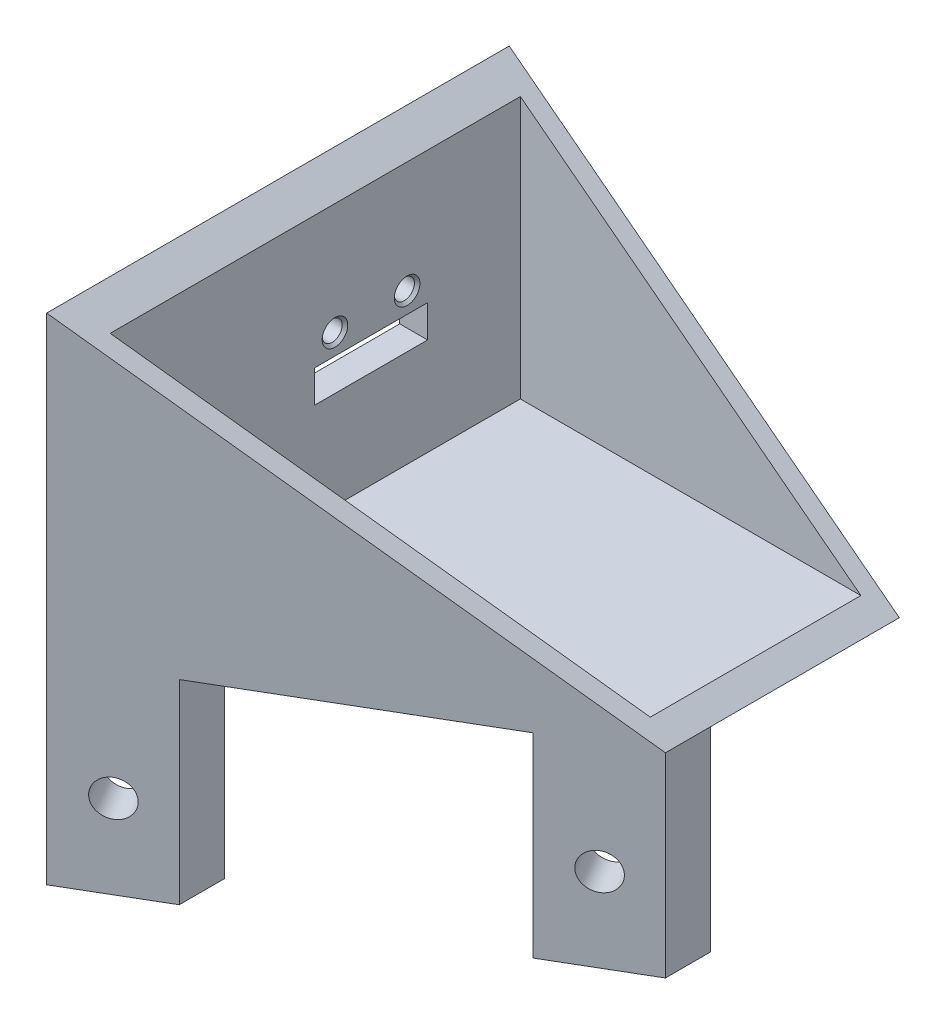
ISO-10303-21;
HEADER;
FILE_DESCRIPTION(('STEP AP214'),'2;1');
FILE_NAME('part.step','',(''),(''),'','','');
FILE_SCHEMA(('AUTOMOTIVE_DESIGN { 1 0 10303 214 1 1 1 1 }'));
ENDSEC;
DATA;
#1=APPLICATION_CONTEXT('core data for automotive mechanical design processes');
#2=APPLICATION_PROTOCOL_DEFINITION('international standard','automotive_design',2000,#1);
#3=PRODUCT_CONTEXT('',#1,'mechanical');
#4=PRODUCT('Part','Part','',(#3));
#5=PRODUCT_RELATED_PRODUCT_CATEGORY('part','',(#4));
#6=PRODUCT_DEFINITION_FORMATION('','',#4);
#7=PRODUCT_DEFINITION_CONTEXT('part definition',#1,'design');
#8=PRODUCT_DEFINITION('design','',#6,#7);
#9=PRODUCT_DEFINITION_SHAPE('','',#8);
#10=(LENGTH_UNIT() NAMED_UNIT(*) SI_UNIT(.MILLI.,.METRE.));
#11=(NAMED_UNIT(*) PLANE_ANGLE_UNIT() SI_UNIT($,.RADIAN.));
#12=(NAMED_UNIT(*) SI_UNIT($,.STERADIAN.) SOLID_ANGLE_UNIT());
#13=UNCERTAINTY_MEASURE_WITH_UNIT(LENGTH_MEASURE(1.E-05),#10,'distance_accuracy_value','');
#14=(GEOMETRIC_REPRESENTATION_CONTEXT(3) GLOBAL_UNCERTAINTY_ASSIGNED_CONTEXT((#13)) GLOBAL_UNIT_ASSIGNED_CONTEXT((#10,
#11,#12)) REPRESENTATION_CONTEXT('',''));
#15=CARTESIAN_POINT('',(0.,0.,0.));
#16=DIRECTION('',(0.,0.,1.));
#17=DIRECTION('',(1.,0.,0.));
#18=AXIS2_PLACEMENT_3D('',#15,#16,#17);
#19=CARTESIAN_POINT('',(1379.94586519212,1313.31561617139,0.));
#20=DIRECTION('',(0.,1.,0.));
#21=DIRECTION('',(0.,0.,1.));
#22=AXIS2_PLACEMENT_3D('',#19,#20,#21);
#23=PLANE('',#22);
#24=DIRECTION('',(0.,0.,1.));
#25=VECTOR('',#24,1.);
#26=CARTESIAN_POINT('',(1376.04586519212,1313.31561617139,1619.04822717547));
#27=LINE('',#26,#25);
#28=CARTESIAN_POINT('',(1376.04586519212,1313.31561617139,1539.04822717547));
#29=VERTEX_POINT('',#28);
#30=CARTESIAN_POINT('',(1376.04586519212,1313.31561617139,1576.8384338469));
#31=VERTEX_POINT('',#30);
#32=EDGE_CURVE('E266',#29,#31,#27,.T.);
#33=ORIENTED_EDGE('',*,*,#32,.F.);
#34=DIRECTION('',(-1.,0.,0.));
#35=VECTOR('',#34,1.);
#36=CARTESIAN_POINT('',(1314.94586519212,1313.31561617139,1539.04822717547));
#37=LINE('',#36,#35);
#38=CARTESIAN_POINT('',(1314.94586519212,1313.31561617139,1539.04822717547));
#39=VERTEX_POINT('',#38);
#40=EDGE_CURVE('E242',#29,#39,#37,.T.);
#41=ORIENTED_EDGE('',*,*,#40,.T.);
#42=DIRECTION('',(0.,0.,-1.));
#43=VECTOR('',#42,1.);
#44=CARTESIAN_POINT('',(1314.94586519212,1313.31561617139,0.));
#45=LINE('',#44,#43);
#46=CARTESIAN_POINT('',(1314.94586519212,1313.31561617139,1576.8384338469));
#47=VERTEX_POINT('',#46);
#48=EDGE_CURVE('E256',#47,#39,#45,.T.);
#49=ORIENTED_EDGE('',*,*,#48,.F.);
#50=DIRECTION('',(-1.,0.,0.));
#51=VECTOR('',#50,1.);
#52=CARTESIAN_POINT('',(1379.94586519212,1313.31561617139,1576.8384338469));
#53=LINE('',#52,#51);
#54=EDGE_CURVE('E261',#31,#47,#53,.T.);
#55=ORIENTED_EDGE('',*,*,#54,.F.);
#56=EDGE_LOOP('',(#33,#41,#49,#55));
#57=FACE_BOUND('',#56,.T.);
#58=ADVANCED_FACE('F47',(#57),#23,.T.);
#59=CARTESIAN_POINT('',(0.,1310.31561617139,0.));
#60=DIRECTION('',(0.,1.,0.));
#61=DIRECTION('',(0.,0.,1.));
#62=AXIS2_PLACEMENT_3D('',#59,#60,#61);
#63=PLANE('',#62);
#64=DIRECTION('',(0.862702426419676,0.,-0.505711897674559));
#65=VECTOR('',#64,1.);
#66=CARTESIAN_POINT('',(1309.94586519212,1310.31561617139,1619.04822717547));
#67=LINE('',#66,#65);
#68=CARTESIAN_POINT('',(1324.94586519212,1310.31561617139,1610.25530132663));
#69=VERTEX_POINT('',#68);
#70=CARTESIAN_POINT('',(1364.94586519212,1310.31561617139,1586.80749906307));
#71=VERTEX_POINT('',#70);
#72=EDGE_CURVE('E278',#69,#71,#67,.T.);
#73=ORIENTED_EDGE('',*,*,#72,.F.);
#74=DIRECTION('',(0.,0.,-1.));
#75=VECTOR('',#74,1.);
#76=CARTESIAN_POINT('',(1324.94586519212,1310.31561617139,0.));
#77=LINE('',#76,#75);
#78=CARTESIAN_POINT('',(1324.94586519212,1310.31561617139,1602.14126364037));
#79=VERTEX_POINT('',#78);
#80=EDGE_CURVE('E304',#69,#79,#77,.T.);
#81=ORIENTED_EDGE('',*,*,#80,.T.);
#82=DIRECTION('',(0.862702426419676,0.,-0.505711897674558));
#83=VECTOR('',#82,1.);
#84=CARTESIAN_POINT('',(1037.82804690447,1310.31561617139,1770.44830937922));
#85=LINE('',#84,#83);
#86=CARTESIAN_POINT('',(1309.94586519212,1310.31561617139,1610.93418948921));
#87=VERTEX_POINT('',#86);
#88=EDGE_CURVE('E293',#87,#79,#85,.T.);
#89=ORIENTED_EDGE('',*,*,#88,.F.);
#90=DIRECTION('',(0.,0.,1.));
#91=VECTOR('',#90,1.);
#92=CARTESIAN_POINT('',(1309.94586519212,1310.31561617139,0.));
#93=LINE('',#92,#91);
#94=CARTESIAN_POINT('',(1309.94586519212,1310.31561617139,1536.04822717547));
#95=VERTEX_POINT('',#94);
#96=EDGE_CURVE('E356',#95,#87,#93,.T.);
#97=ORIENTED_EDGE('',*,*,#96,.F.);
#98=DIRECTION('',(-1.,0.,0.));
#99=VECTOR('',#98,1.);
#100=CARTESIAN_POINT('',(1379.94586519212,1310.31561617139,1536.04822717547));
#101=LINE('',#100,#99);
#102=CARTESIAN_POINT('',(1379.94586519212,1310.31561617139,1536.04822717547));
#103=VERTEX_POINT('',#102);
#104=EDGE_CURVE('E246',#103,#95,#101,.T.);
#105=ORIENTED_EDGE('',*,*,#104,.F.);
#106=DIRECTION('',(0.,0.,1.));
#107=VECTOR('',#106,1.);
#108=CARTESIAN_POINT('',(1379.94586519212,1310.31561617139,0.));
#109=LINE('',#108,#107);
#110=CARTESIAN_POINT('',(1379.94586519212,1310.31561617139,1569.90053552798));
#111=VERTEX_POINT('',#110);
#112=EDGE_CURVE('E185',#103,#111,#109,.T.);
#113=ORIENTED_EDGE('',*,*,#112,.T.);
#114=DIRECTION('',(0.862702426419676,0.,-0.505711897674558));
#115=VECTOR('',#114,1.);
#116=CARTESIAN_POINT('',(1037.82804690447,1310.31561617139,1770.44830937922));
#117=LINE('',#116,#115);
#118=CARTESIAN_POINT('',(1364.94586519212,1310.31561617139,1578.69346137681));
#119=VERTEX_POINT('',#118);
#120=EDGE_CURVE('E338',#119,#111,#117,.T.);
#121=ORIENTED_EDGE('',*,*,#120,.F.);
#122=DIRECTION('',(0.,0.,-1.));
#123=VECTOR('',#122,1.);
#124=CARTESIAN_POINT('',(1364.94586519212,1310.31561617139,0.));
#125=LINE('',#124,#123);
#126=EDGE_CURVE('E290',#71,#119,#125,.T.);
#127=ORIENTED_EDGE('',*,*,#126,.F.);
#128=EDGE_LOOP('',(#73,#81,#89,#97,#105,#113,#121,#127));
#129=FACE_BOUND('',#128,.T.);
#130=ADVANCED_FACE('F428',(#129),#63,.F.);
#131=CARTESIAN_POINT('',(1146.22905807246,1490.09777549421,1619.04822717547));
#132=DIRECTION('',(0.609710760849692,0.792623989104601,0.));
#133=DIRECTION('',(-0.792623989104601,0.609710760849692,0.));
#134=AXIS2_PLACEMENT_3D('',#131,#132,#133);
#135=PLANE('',#134);
#136=DIRECTION('',(0.718821889872621,-0.552939915286631,-0.421369838411302));
#137=VECTOR('',#136,1.);
#138=CARTESIAN_POINT('',(1174.24869753423,1468.54420667746,1695.13093596162));
#139=LINE('',#138,#137);
#140=CARTESIAN_POINT('',(1314.94586519212,1360.31561617139,1612.65495180449));
#141=VERTEX_POINT('',#140);
#142=EDGE_CURVE('E194',#141,#31,#139,.T.);
#143=ORIENTED_EDGE('',*,*,#142,.F.);
#144=DIRECTION('',(0.,0.,-1.));
#145=VECTOR('',#144,1.);
#146=CARTESIAN_POINT('',(1314.94586519212,1360.31561617139,0.));
#147=LINE('',#146,#145);
#148=CARTESIAN_POINT('',(1314.94586519212,1360.31561617139,1539.04822717547));
#149=VERTEX_POINT('',#148);
#150=EDGE_CURVE('E257',#141,#149,#147,.T.);
#151=ORIENTED_EDGE('',*,*,#150,.T.);
#152=DIRECTION('',(0.792623989104601,-0.609710760849691,0.));
#153=VECTOR('',#152,1.);
#154=CARTESIAN_POINT('',(1376.04586519212,1313.31561617139,1539.04822717547));
#155=LINE('',#154,#153);
#156=EDGE_CURVE('E233',#149,#29,#155,.T.);
#157=ORIENTED_EDGE('',*,*,#156,.T.);
#158=ORIENTED_EDGE('',*,*,#32,.T.);
#159=EDGE_LOOP('',(#143,#151,#157,#158));
#160=FACE_BOUND('',#159,.T.);
#161=DIRECTION('',(0.,0.,-1.));
#162=VECTOR('',#161,1.);
#163=CARTESIAN_POINT('',(1309.94586519212,1364.16177001755,1624.39286725715));
#164=LINE('',#163,#162);
#165=CARTESIAN_POINT('',(1309.94586519212,1364.16177001755,1619.04822717547));
#166=VERTEX_POINT('',#165);
#167=CARTESIAN_POINT('',(1309.94586519212,1364.16177001755,1536.04822717547));
#168=VERTEX_POINT('',#167);
#169=EDGE_CURVE('E177',#166,#168,#164,.T.);
#170=ORIENTED_EDGE('',*,*,#169,.F.);
#171=DIRECTION('',(0.718821889872622,-0.552939915286631,-0.421369838411301));
#172=VECTOR('',#171,1.);
#173=CARTESIAN_POINT('',(1175.29739313558,1467.73751775335,1697.97849587228));
#174=LINE('',#173,#172);
#175=CARTESIAN_POINT('',(1379.94586519212,1310.31561617139,1578.01457321424));
#176=VERTEX_POINT('',#175);
#177=EDGE_CURVE('E181',#166,#176,#174,.T.);
#178=ORIENTED_EDGE('',*,*,#177,.T.);
#179=DIRECTION('',(0.,0.,1.));
#180=VECTOR('',#179,1.);
#181=CARTESIAN_POINT('',(1379.94586519212,1310.31561617139,0.));
#182=LINE('',#181,#180);
#183=EDGE_CURVE('E324',#111,#176,#182,.T.);
#184=ORIENTED_EDGE('',*,*,#183,.F.);
#185=ORIENTED_EDGE('',*,*,#112,.F.);
#186=DIRECTION('',(0.792623989104612,-0.609710760849677,0.));
#187=VECTOR('',#186,1.);
#188=CARTESIAN_POINT('',(1376.04586519212,1313.31561617139,1536.04822717547));
#189=LINE('',#188,#187);
#190=EDGE_CURVE('E199',#168,#103,#189,.T.);
#191=ORIENTED_EDGE('',*,*,#190,.F.);
#192=EDGE_LOOP('',(#170,#178,#184,#185,#191));
#193=FACE_BOUND('',#192,.T.);
#194=ADVANCED_FACE('F198',(#160,#193),#135,.T.);
#195=CARTESIAN_POINT('',(1309.94586519212,1360.31561617139,0.));
#196=DIRECTION('',(1.,0.,0.));
#197=DIRECTION('',(0.,0.,-1.));
#198=AXIS2_PLACEMENT_3D('',#195,#196,#197);
#199=PLANE('',#198);
#200=DIRECTION('',(0.,0.,-1.));
#201=VECTOR('',#200,1.);
#202=CARTESIAN_POINT('',(1309.94586519212,1336.60561617139,0.));
#203=LINE('',#202,#201);
#204=CARTESIAN_POINT('',(1309.94586519212,1336.60561617139,1575.99434883277));
#205=VERTEX_POINT('',#204);
#206=CARTESIAN_POINT('',(1309.94586519212,1336.60561617139,1555.69434883277));
#207=VERTEX_POINT('',#206);
#208=EDGE_CURVE('E218',#205,#207,#203,.T.);
#209=ORIENTED_EDGE('',*,*,#208,.F.);
#210=DIRECTION('',(0.,-1.,0.));
#211=VECTOR('',#210,1.);
#212=CARTESIAN_POINT('',(1309.94586519212,-5.078970138616E-11,1575.99434883273));
#213=LINE('',#212,#211);
#214=CARTESIAN_POINT('',(1309.94586519212,1330.80561617139,1575.99434883277));
#215=VERTEX_POINT('',#214);
#216=EDGE_CURVE('E210',#205,#215,#213,.T.);
#217=ORIENTED_EDGE('',*,*,#216,.T.);
#218=DIRECTION('',(0.,0.,-1.));
#219=VECTOR('',#218,1.);
#220=CARTESIAN_POINT('',(1309.94586519212,1330.80561617139,0.));
#221=LINE('',#220,#219);
#222=CARTESIAN_POINT('',(1309.94586519212,1330.80561617139,1555.69434883277));
#223=VERTEX_POINT('',#222);
#224=EDGE_CURVE('E214',#215,#223,#221,.T.);
#225=ORIENTED_EDGE('',*,*,#224,.T.);
#226=DIRECTION('',(0.,-1.,0.));
#227=VECTOR('',#226,1.);
#228=CARTESIAN_POINT('',(1309.94586519212,0.,1555.69434883277));
#229=LINE('',#228,#227);
#230=EDGE_CURVE('E216',#207,#223,#229,.T.);
#231=ORIENTED_EDGE('',*,*,#230,.F.);
#232=EDGE_LOOP('',(#209,#217,#225,#231));
#233=FACE_BOUND('',#232,.T.);
#234=CARTESIAN_POINT('',(1309.94586519212,1340.29561617139,1559.36934883277));
#235=DIRECTION('',(1.,0.,0.));
#236=DIRECTION('',(0.,0.,-1.));
#237=AXIS2_PLACEMENT_3D('',#234,#235,#236);
#238=CIRCLE('',#237,1.79999999999998);
#239=CARTESIAN_POINT('',(1309.94586519212,1340.29561617139,1557.56934883277));
#240=VERTEX_POINT('',#239);
#241=EDGE_CURVE('E354',#240,#240,#238,.T.);
#242=ORIENTED_EDGE('',*,*,#241,.T.);
#243=EDGE_LOOP('',(#242));
#244=FACE_BOUND('',#243,.T.);
#245=CARTESIAN_POINT('',(1309.94586519212,1340.29561617139,1572.31934883277));
#246=DIRECTION('',(1.,0.,0.));
#247=DIRECTION('',(0.,0.,-1.));
#248=AXIS2_PLACEMENT_3D('',#245,#246,#247);
#249=CIRCLE('',#248,1.79999999999998);
#250=CARTESIAN_POINT('',(1309.94586519212,1340.29561617139,1570.51934883277));
#251=VERTEX_POINT('',#250);
#252=EDGE_CURVE('E318',#251,#251,#249,.T.);
#253=ORIENTED_EDGE('',*,*,#252,.T.);
#254=EDGE_LOOP('',(#253));
#255=FACE_BOUND('',#254,.T.);
#256=ORIENTED_EDGE('',*,*,#96,.T.);
#257=DIRECTION('',(0.,1.,0.));
#258=VECTOR('',#257,1.);
#259=CARTESIAN_POINT('',(1309.94586519212,1275.31561617139,1610.93418948921));
#260=LINE('',#259,#258);
#261=CARTESIAN_POINT('',(1309.94586519212,1275.31561617139,1610.93418948921));
#262=VERTEX_POINT('',#261);
#263=EDGE_CURVE('E315',#262,#87,#260,.T.);
#264=ORIENTED_EDGE('',*,*,#263,.F.);
#265=DIRECTION('',(0.,0.,-1.));
#266=VECTOR('',#265,1.);
#267=CARTESIAN_POINT('',(1309.94586519212,1275.31561617139,0.));
#268=LINE('',#267,#266);
#269=CARTESIAN_POINT('',(1309.94586519212,1275.31561617139,1619.04822717547));
#270=VERTEX_POINT('',#269);
#271=EDGE_CURVE('E179',#270,#262,#268,.T.);
#272=ORIENTED_EDGE('',*,*,#271,.F.);
#273=DIRECTION('',(0.,-1.,0.));
#274=VECTOR('',#273,1.);
#275=CARTESIAN_POINT('',(1309.94586519212,1360.31561617139,1619.04822717547));
#276=LINE('',#275,#274);
#277=EDGE_CURVE('E169',#166,#270,#276,.T.);
#278=ORIENTED_EDGE('',*,*,#277,.F.);
#279=ORIENTED_EDGE('',*,*,#169,.T.);
#280=DIRECTION('',(0.,1.,0.));
#281=VECTOR('',#280,1.);
#282=CARTESIAN_POINT('',(1309.94586519212,1360.31561617139,1536.04822717547));
#283=LINE('',#282,#281);
#284=EDGE_CURVE('E251',#95,#168,#283,.T.);
#285=ORIENTED_EDGE('',*,*,#284,.F.);
#286=EDGE_LOOP('',(#256,#264,#272,#278,#279,#285));
#287=FACE_BOUND('',#286,.T.);
#288=ADVANCED_FACE('F173',(#233,#244,#255,#287),#199,.F.);
#289=CARTESIAN_POINT('',(1309.94586519212,1340.29561617139,1572.31934883277));
#290=DIRECTION('',(1.,0.,0.));
#291=DIRECTION('',(0.,0.,-1.));
#292=AXIS2_PLACEMENT_3D('',#289,#290,#291);
#293=CYLINDRICAL_SURFACE('',#292,1.79999999999998);
#294=CARTESIAN_POINT('',(1314.44586519212,1340.29561617139,1572.31934883277));
#295=DIRECTION('',(-1.,0.,0.));
#296=DIRECTION('',(0.,0.,1.));
#297=AXIS2_PLACEMENT_3D('',#294,#295,#296);
#298=CIRCLE('',#297,1.79999999999998);
#299=CARTESIAN_POINT('',(1314.44586519212,1340.29561617139,1574.11934883277));
#300=VERTEX_POINT('',#299);
#301=EDGE_CURVE('E11',#300,#300,#298,.F.);
#302=ORIENTED_EDGE('',*,*,#301,.T.);
#303=EDGE_LOOP('',(#302));
#304=FACE_BOUND('',#303,.T.);
#305=ORIENTED_EDGE('',*,*,#252,.F.);
#306=EDGE_LOOP('',(#305));
#307=FACE_BOUND('',#306,.T.);
#308=ADVANCED_FACE('F473',(#304,#307),#293,.F.);
#309=CARTESIAN_POINT('',(1309.94586519212,1340.29561617139,1559.36934883277));
#310=DIRECTION('',(1.,0.,0.));
#311=DIRECTION('',(0.,0.,-1.));
#312=AXIS2_PLACEMENT_3D('',#309,#310,#311);
#313=CYLINDRICAL_SURFACE('',#312,1.79999999999998);
#314=CARTESIAN_POINT('',(1314.44586519212,1340.29561617139,1559.36934883277));
#315=DIRECTION('',(-1.,0.,0.));
#316=DIRECTION('',(0.,0.,1.));
#317=AXIS2_PLACEMENT_3D('',#314,#315,#316);
#318=CIRCLE('',#317,1.79999999999998);
#319=CARTESIAN_POINT('',(1314.44586519212,1340.29561617139,1561.16934883277));
#320=VERTEX_POINT('',#319);
#321=EDGE_CURVE('E58',#320,#320,#318,.F.);
#322=ORIENTED_EDGE('',*,*,#321,.T.);
#323=EDGE_LOOP('',(#322));
#324=FACE_BOUND('',#323,.T.);
#325=ORIENTED_EDGE('',*,*,#241,.F.);
#326=EDGE_LOOP('',(#325));
#327=FACE_BOUND('',#326,.T.);
#328=ADVANCED_FACE('F468',(#324,#327),#313,.F.);
#329=CARTESIAN_POINT('',(1364.94586519212,1275.31561617139,0.));
#330=DIRECTION('',(1.,0.,0.));
#331=DIRECTION('',(0.,0.,-1.));
#332=AXIS2_PLACEMENT_3D('',#329,#330,#331);
#333=PLANE('',#332);
#334=ORIENTED_EDGE('',*,*,#126,.T.);
#335=DIRECTION('',(0.,1.,0.));
#336=VECTOR('',#335,1.);
#337=CARTESIAN_POINT('',(1364.94586519212,1275.31561617139,1578.69346137681));
#338=LINE('',#337,#336);
#339=CARTESIAN_POINT('',(1364.94586519212,1275.31561617139,1578.69346137681));
#340=VERTEX_POINT('',#339);
#341=EDGE_CURVE('E348',#340,#119,#338,.T.);
#342=ORIENTED_EDGE('',*,*,#341,.F.);
#343=DIRECTION('',(0.,0.,-1.));
#344=VECTOR('',#343,1.);
#345=CARTESIAN_POINT('',(1364.94586519212,1275.31561617139,0.));
#346=LINE('',#345,#344);
#347=CARTESIAN_POINT('',(1364.94586519212,1275.31561617139,1586.80749906307));
#348=VERTEX_POINT('',#347);
#349=EDGE_CURVE('E323',#348,#340,#346,.T.);
#350=ORIENTED_EDGE('',*,*,#349,.F.);
#351=DIRECTION('',(0.,1.,0.));
#352=VECTOR('',#351,1.);
#353=CARTESIAN_POINT('',(1364.94586519212,1275.31561617139,1586.80749906307));
#354=LINE('',#353,#352);
#355=EDGE_CURVE('E310',#348,#71,#354,.T.);
#356=ORIENTED_EDGE('',*,*,#355,.T.);
#357=EDGE_LOOP('',(#334,#342,#350,#356));
#358=FACE_BOUND('',#357,.T.);
#359=ADVANCED_FACE('F462',(#358),#333,.F.);
#360=CARTESIAN_POINT('',(1037.82804690447,1275.31561617139,1770.44830937922));
#361=DIRECTION('',(0.505711897674558,0.,0.862702426419676));
#362=DIRECTION('',(0.862702426419676,0.,-0.505711897674558));
#363=AXIS2_PLACEMENT_3D('',#360,#361,#362);
#364=PLANE('',#363);
#365=CARTESIAN_POINT('',(1368.95452813957,1290.31561617139,1576.34360297348));
#366=DIRECTION('',(0.505711897674558,0.,0.862702426419676));
#367=DIRECTION('',(0.862702426419676,0.,-0.505711897674558));
#368=AXIS2_PLACEMENT_3D('',#365,#366,#367);
#369=CIRCLE('',#368,3.25399999999979);
#370=CARTESIAN_POINT('',(1371.76176183514,1290.31561617139,1574.69801645845));
#371=VERTEX_POINT('',#370);
#372=EDGE_CURVE('E272',#371,#371,#369,.F.);
#373=ORIENTED_EDGE('',*,*,#372,.F.);
#374=EDGE_LOOP('',(#373));
#375=FACE_BOUND('',#374,.T.);
#376=ORIENTED_EDGE('',*,*,#120,.T.);
#377=DIRECTION('',(0.,1.,0.));
#378=VECTOR('',#377,1.);
#379=CARTESIAN_POINT('',(1379.94586519212,1275.31561617139,1569.90053552798));
#380=LINE('',#379,#378);
#381=CARTESIAN_POINT('',(1379.94586519212,1275.31561617139,1569.90053552798));
#382=VERTEX_POINT('',#381);
#383=EDGE_CURVE('E342',#382,#111,#380,.T.);
#384=ORIENTED_EDGE('',*,*,#383,.F.);
#385=DIRECTION('',(0.862702426419676,0.,-0.505711897674558));
#386=VECTOR('',#385,1.);
#387=CARTESIAN_POINT('',(1037.82804690447,1275.31561617139,1770.44830937922));
#388=LINE('',#387,#386);
#389=EDGE_CURVE('E330',#340,#382,#388,.T.);
#390=ORIENTED_EDGE('',*,*,#389,.F.);
#391=ORIENTED_EDGE('',*,*,#341,.T.);
#392=EDGE_LOOP('',(#376,#384,#390,#391));
#393=FACE_BOUND('',#392,.T.);
#394=ADVANCED_FACE('F464',(#375,#393),#364,.F.);
#395=CARTESIAN_POINT('',(1379.94586519212,1275.31561617139,0.));
#396=DIRECTION('',(-1.,0.,0.));
#397=DIRECTION('',(0.,0.,1.));
#398=AXIS2_PLACEMENT_3D('',#395,#396,#397);
#399=PLANE('',#398);
#400=ORIENTED_EDGE('',*,*,#183,.T.);
#401=DIRECTION('',(0.,1.,0.));
#402=VECTOR('',#401,1.);
#403=CARTESIAN_POINT('',(1379.94586519212,1275.31561617139,1578.01457321424));
#404=LINE('',#403,#402);
#405=CARTESIAN_POINT('',(1379.94586519212,1275.31561617139,1578.01457321424));
#406=VERTEX_POINT('',#405);
#407=EDGE_CURVE('E191',#406,#176,#404,.T.);
#408=ORIENTED_EDGE('',*,*,#407,.F.);
#409=DIRECTION('',(0.,0.,1.));
#410=VECTOR('',#409,1.);
#411=CARTESIAN_POINT('',(1379.94586519212,1275.31561617139,0.));
#412=LINE('',#411,#410);
#413=EDGE_CURVE('E328',#382,#406,#412,.T.);
#414=ORIENTED_EDGE('',*,*,#413,.F.);
#415=ORIENTED_EDGE('',*,*,#383,.T.);
#416=EDGE_LOOP('',(#400,#408,#414,#415));
#417=FACE_BOUND('',#416,.T.);
#418=ADVANCED_FACE('F460',(#417),#399,.F.);
#419=CARTESIAN_POINT('',(0.,1275.31561617139,0.));
#420=DIRECTION('',(0.,-1.,0.));
#421=DIRECTION('',(0.,0.,-1.));
#422=AXIS2_PLACEMENT_3D('',#419,#420,#421);
#423=PLANE('',#422);
#424=DIRECTION('',(0.862702426419676,0.,-0.505711897674559));
#425=VECTOR('',#424,1.);
#426=CARTESIAN_POINT('',(1041.36803018819,1275.31561617139,1776.48722636415));
#427=LINE('',#426,#425);
#428=EDGE_CURVE('E319',#348,#406,#427,.T.);
#429=ORIENTED_EDGE('',*,*,#428,.F.);
#430=ORIENTED_EDGE('',*,*,#349,.T.);
#431=ORIENTED_EDGE('',*,*,#389,.T.);
#432=ORIENTED_EDGE('',*,*,#413,.T.);
#433=EDGE_LOOP('',(#429,#430,#431,#432));
#434=FACE_BOUND('',#433,.T.);
#435=ADVANCED_FACE('F454',(#434),#423,.T.);
#436=CARTESIAN_POINT('',(1324.94586519212,1275.31561617139,0.));
#437=DIRECTION('',(1.,0.,0.));
#438=DIRECTION('',(0.,0.,-1.));
#439=AXIS2_PLACEMENT_3D('',#436,#437,#438);
#440=PLANE('',#439);
#441=ORIENTED_EDGE('',*,*,#80,.F.);
#442=DIRECTION('',(0.,1.,0.));
#443=VECTOR('',#442,1.);
#444=CARTESIAN_POINT('',(1324.94586519212,1275.31561617139,1610.25530132663));
#445=LINE('',#444,#443);
#446=CARTESIAN_POINT('',(1324.94586519212,1275.31561617139,1610.25530132663));
#447=VERTEX_POINT('',#446);
#448=EDGE_CURVE('E316',#447,#69,#445,.T.);
#449=ORIENTED_EDGE('',*,*,#448,.F.);
#450=DIRECTION('',(0.,0.,-1.));
#451=VECTOR('',#450,1.);
#452=CARTESIAN_POINT('',(1324.94586519212,1275.31561617139,0.));
#453=LINE('',#452,#451);
#454=CARTESIAN_POINT('',(1324.94586519212,1275.31561617139,1602.14126364037));
#455=VERTEX_POINT('',#454);
#456=EDGE_CURVE('E288',#447,#455,#453,.T.);
#457=ORIENTED_EDGE('',*,*,#456,.T.);
#458=DIRECTION('',(0.,1.,0.));
#459=VECTOR('',#458,1.);
#460=CARTESIAN_POINT('',(1324.94586519212,1275.31561617139,1602.14126364037));
#461=LINE('',#460,#459);
#462=EDGE_CURVE('E305',#455,#79,#461,.T.);
#463=ORIENTED_EDGE('',*,*,#462,.T.);
#464=EDGE_LOOP('',(#441,#449,#457,#463));
#465=FACE_BOUND('',#464,.T.);
#466=ADVANCED_FACE('F449',(#465),#440,.T.);
#467=CARTESIAN_POINT('',(1041.36803018819,1275.31561617139,1776.48722636415));
#468=DIRECTION('',(0.505711897674559,0.,0.862702426419676));
#469=DIRECTION('',(0.862702426419676,0.,-0.505711897674559));
#470=AXIS2_PLACEMENT_3D('',#467,#468,#469);
#471=PLANE('',#470);
#472=CARTESIAN_POINT('',(1372.49451142329,1290.31561617139,1582.38251995842));
#473=DIRECTION('',(0.50571189767456,0.,0.862702426419675));
#474=DIRECTION('',(0.862702426419675,0.,-0.50571189767456));
#475=AXIS2_PLACEMENT_3D('',#472,#473,#474);
#476=CIRCLE('',#475,3.25399999999979);
#477=CARTESIAN_POINT('',(1375.30174511886,1290.31561617139,1580.73693344339));
#478=VERTEX_POINT('',#477);
#479=EDGE_CURVE('E269',#478,#478,#476,.T.);
#480=ORIENTED_EDGE('',*,*,#479,.F.);
#481=EDGE_LOOP('',(#480));
#482=FACE_BOUND('',#481,.T.);
#483=CARTESIAN_POINT('',(1317.49451142329,1290.31561617139,1614.62324807082));
#484=DIRECTION('',(0.505711897674561,0.,0.862702426419675));
#485=DIRECTION('',(0.862702426419675,0.,-0.505711897674561));
#486=AXIS2_PLACEMENT_3D('',#483,#484,#485);
#487=CIRCLE('',#486,3.2539999999995);
#488=CARTESIAN_POINT('',(1320.30174511886,1290.31561617139,1612.97766155578));
#489=VERTEX_POINT('',#488);
#490=EDGE_CURVE('E274',#489,#489,#487,.T.);
#491=ORIENTED_EDGE('',*,*,#490,.F.);
#492=EDGE_LOOP('',(#491));
#493=FACE_BOUND('',#492,.T.);
#494=ORIENTED_EDGE('',*,*,#448,.T.);
#495=ORIENTED_EDGE('',*,*,#72,.T.);
#496=ORIENTED_EDGE('',*,*,#355,.F.);
#497=ORIENTED_EDGE('',*,*,#428,.T.);
#498=ORIENTED_EDGE('',*,*,#407,.T.);
#499=ORIENTED_EDGE('',*,*,#177,.F.);
#500=ORIENTED_EDGE('',*,*,#277,.T.);
#501=DIRECTION('',(0.862702426419676,0.,-0.505711897674559));
#502=VECTOR('',#501,1.);
#503=CARTESIAN_POINT('',(1041.36803018819,1275.31561617139,1776.48722636415));
#504=LINE('',#503,#502);
#505=EDGE_CURVE('E292',#270,#447,#504,.T.);
#506=ORIENTED_EDGE('',*,*,#505,.T.);
#507=EDGE_LOOP('',(#494,#495,#496,#497,#498,#499,#500,#506));
#508=FACE_BOUND('',#507,.T.);
#509=ADVANCED_FACE('F186',(#482,#493,#508),#471,.T.);
#510=CARTESIAN_POINT('',(1037.82804690447,1275.31561617139,1770.44830937922));
#511=DIRECTION('',(0.505711897674558,0.,0.862702426419676));
#512=DIRECTION('',(0.862702426419676,0.,-0.505711897674558));
#513=AXIS2_PLACEMENT_3D('',#510,#511,#512);
#514=PLANE('',#513);
#515=CARTESIAN_POINT('',(1313.95452813957,1290.31561617139,1608.58433108588));
#516=DIRECTION('',(0.505711897674558,0.,0.862702426419676));
#517=DIRECTION('',(0.862702426419676,0.,-0.505711897674558));
#518=AXIS2_PLACEMENT_3D('',#515,#516,#517);
#519=CIRCLE('',#518,3.2539999999995);
#520=CARTESIAN_POINT('',(1316.76176183514,1290.31561617139,1606.93874457085));
#521=VERTEX_POINT('',#520);
#522=EDGE_CURVE('E267',#521,#521,#519,.F.);
#523=ORIENTED_EDGE('',*,*,#522,.F.);
#524=EDGE_LOOP('',(#523));
#525=FACE_BOUND('',#524,.T.);
#526=ORIENTED_EDGE('',*,*,#88,.T.);
#527=ORIENTED_EDGE('',*,*,#462,.F.);
#528=DIRECTION('',(0.862702426419676,0.,-0.505711897674558));
#529=VECTOR('',#528,1.);
#530=CARTESIAN_POINT('',(1037.82804690447,1275.31561617139,1770.44830937922));
#531=LINE('',#530,#529);
#532=EDGE_CURVE('E299',#262,#455,#531,.T.);
#533=ORIENTED_EDGE('',*,*,#532,.F.);
#534=ORIENTED_EDGE('',*,*,#263,.T.);
#535=EDGE_LOOP('',(#526,#527,#533,#534));
#536=FACE_BOUND('',#535,.T.);
#537=ADVANCED_FACE('F442',(#525,#536),#514,.F.);
#538=CARTESIAN_POINT('',(0.,1275.31561617139,0.));
#539=DIRECTION('',(0.,-1.,0.));
#540=DIRECTION('',(0.,0.,-1.));
#541=AXIS2_PLACEMENT_3D('',#538,#539,#540);
#542=PLANE('',#541);
#543=ORIENTED_EDGE('',*,*,#456,.F.);
#544=ORIENTED_EDGE('',*,*,#505,.F.);
#545=ORIENTED_EDGE('',*,*,#271,.T.);
#546=ORIENTED_EDGE('',*,*,#532,.T.);
#547=EDGE_LOOP('',(#543,#544,#545,#546));
#548=FACE_BOUND('',#547,.T.);
#549=ADVANCED_FACE('F438',(#548),#542,.T.);
#550=CARTESIAN_POINT('',(1309.30010660433,1290.31561617139,1600.64427515583));
#551=DIRECTION('',(0.505711897674561,0.,0.862702426419675));
#552=DIRECTION('',(0.862702426419675,0.,-0.505711897674561));
#553=AXIS2_PLACEMENT_3D('',#550,#551,#552);
#554=CYLINDRICAL_SURFACE('',#553,3.2539999999995);
#555=ORIENTED_EDGE('',*,*,#522,.T.);
#556=EDGE_LOOP('',(#555));
#557=FACE_BOUND('',#556,.T.);
#558=ORIENTED_EDGE('',*,*,#490,.T.);
#559=EDGE_LOOP('',(#558));
#560=FACE_BOUND('',#559,.T.);
#561=ADVANCED_FACE('F422',(#557,#560),#554,.F.);
#562=CARTESIAN_POINT('',(1364.30010660434,1290.31561617139,1568.40354704343));
#563=DIRECTION('',(0.505711897674561,0.,0.862702426419675));
#564=DIRECTION('',(0.862702426419675,0.,-0.505711897674561));
#565=AXIS2_PLACEMENT_3D('',#562,#563,#564);
#566=CYLINDRICAL_SURFACE('',#565,3.25399999999979);
#567=ORIENTED_EDGE('',*,*,#372,.T.);
#568=EDGE_LOOP('',(#567));
#569=FACE_BOUND('',#568,.T.);
#570=ORIENTED_EDGE('',*,*,#479,.T.);
#571=EDGE_LOOP('',(#570));
#572=FACE_BOUND('',#571,.T.);
#573=ADVANCED_FACE('F414',(#569,#572),#566,.F.);
#574=CARTESIAN_POINT('',(1379.94586519212,-277.694804413745,364.403257259703));
#575=DIRECTION('',(0.,-0.606118100972325,0.795374658682122));
#576=DIRECTION('',(0.,-0.795374658682122,-0.606118100972325));
#577=AXIS2_PLACEMENT_3D('',#574,#575,#576);
#578=PLANE('',#577);
#579=ORIENTED_EDGE('',*,*,#142,.T.);
#580=ORIENTED_EDGE('',*,*,#54,.T.);
#581=DIRECTION('',(0.,0.795374658682122,0.606118100972325));
#582=VECTOR('',#581,1.);
#583=CARTESIAN_POINT('',(1314.94586519212,-277.694804413745,364.403257259703));
#584=LINE('',#583,#582);
#585=EDGE_CURVE('E265',#47,#141,#584,.T.);
#586=ORIENTED_EDGE('',*,*,#585,.T.);
#587=EDGE_LOOP('',(#579,#580,#586));
#588=FACE_BOUND('',#587,.T.);
#589=ADVANCED_FACE('F415',(#588),#578,.F.);
#590=CARTESIAN_POINT('',(1314.94586519212,0.,0.));
#591=DIRECTION('',(-1.,0.,0.));
#592=DIRECTION('',(0.,0.,1.));
#593=AXIS2_PLACEMENT_3D('',#590,#591,#592);
#594=PLANE('',#593);
#595=DIRECTION('',(0.,0.,-1.));
#596=VECTOR('',#595,1.);
#597=CARTESIAN_POINT('',(1314.94586519212,1330.80561617139,0.));
#598=LINE('',#597,#596);
#599=CARTESIAN_POINT('',(1314.94586519212,1330.80561617139,1575.99434883277));
#600=VERTEX_POINT('',#599);
#601=CARTESIAN_POINT('',(1314.94586519212,1330.80561617139,1555.69434883277));
#602=VERTEX_POINT('',#601);
#603=EDGE_CURVE('E203',#600,#602,#598,.T.);
#604=ORIENTED_EDGE('',*,*,#603,.F.);
#605=DIRECTION('',(0.,-1.,0.));
#606=VECTOR('',#605,1.);
#607=CARTESIAN_POINT('',(1314.94586519212,-5.078970138616E-11,1575.99434883273));
#608=LINE('',#607,#606);
#609=CARTESIAN_POINT('',(1314.94586519212,1336.60561617139,1575.99434883277));
#610=VERTEX_POINT('',#609);
#611=EDGE_CURVE('E77',#610,#600,#608,.T.);
#612=ORIENTED_EDGE('',*,*,#611,.F.);
#613=DIRECTION('',(0.,0.,-1.));
#614=VECTOR('',#613,1.);
#615=CARTESIAN_POINT('',(1314.94586519212,1336.60561617139,0.));
#616=LINE('',#615,#614);
#617=CARTESIAN_POINT('',(1314.94586519212,1336.60561617139,1555.69434883277));
#618=VERTEX_POINT('',#617);
#619=EDGE_CURVE('E211',#610,#618,#616,.T.);
#620=ORIENTED_EDGE('',*,*,#619,.T.);
#621=DIRECTION('',(0.,-1.,0.));
#622=VECTOR('',#621,1.);
#623=CARTESIAN_POINT('',(1314.94586519212,0.,1555.69434883277));
#624=LINE('',#623,#622);
#625=EDGE_CURVE('E221',#618,#602,#624,.T.);
#626=ORIENTED_EDGE('',*,*,#625,.T.);
#627=EDGE_LOOP('',(#604,#612,#620,#626));
#628=FACE_BOUND('',#627,.T.);
#629=CARTESIAN_POINT('',(1314.94586519212,1340.29561617139,1559.36934883277));
#630=DIRECTION('',(-1.,0.,0.));
#631=DIRECTION('',(0.,0.,1.));
#632=AXIS2_PLACEMENT_3D('',#629,#630,#631);
#633=CIRCLE('',#632,2.29999999999997);
#634=CARTESIAN_POINT('',(1314.94586519212,1340.29561617139,1561.66934883277));
#635=VERTEX_POINT('',#634);
#636=EDGE_CURVE('E375',#635,#635,#633,.T.);
#637=ORIENTED_EDGE('',*,*,#636,.T.);
#638=EDGE_LOOP('',(#637));
#639=FACE_BOUND('',#638,.T.);
#640=CARTESIAN_POINT('',(1314.94586519212,1340.29561617139,1572.31934883277));
#641=DIRECTION('',(-1.,0.,0.));
#642=DIRECTION('',(0.,0.,1.));
#643=AXIS2_PLACEMENT_3D('',#640,#641,#642);
#644=CIRCLE('',#643,2.29999999999997);
#645=CARTESIAN_POINT('',(1314.94586519212,1340.29561617139,1574.61934883277));
#646=VERTEX_POINT('',#645);
#647=EDGE_CURVE('E367',#646,#646,#644,.T.);
#648=ORIENTED_EDGE('',*,*,#647,.T.);
#649=EDGE_LOOP('',(#648));
#650=FACE_BOUND('',#649,.T.);
#651=ORIENTED_EDGE('',*,*,#48,.T.);
#652=DIRECTION('',(0.,1.,0.));
#653=VECTOR('',#652,1.);
#654=CARTESIAN_POINT('',(1314.94586519212,1360.31561617139,1539.04822717547));
#655=LINE('',#654,#653);
#656=EDGE_CURVE('E250',#39,#149,#655,.T.);
#657=ORIENTED_EDGE('',*,*,#656,.T.);
#658=ORIENTED_EDGE('',*,*,#150,.F.);
#659=ORIENTED_EDGE('',*,*,#585,.F.);
#660=EDGE_LOOP('',(#651,#657,#658,#659));
#661=FACE_BOUND('',#660,.T.);
#662=ADVANCED_FACE('F396',(#628,#639,#650,#661),#594,.F.);
#663=CARTESIAN_POINT('',(0.,0.,1536.04822717547));
#664=DIRECTION('',(0.,0.,1.));
#665=DIRECTION('',(1.,0.,0.));
#666=AXIS2_PLACEMENT_3D('',#663,#664,#665);
#667=PLANE('',#666);
#668=ORIENTED_EDGE('',*,*,#284,.T.);
#669=ORIENTED_EDGE('',*,*,#190,.T.);
#670=ORIENTED_EDGE('',*,*,#104,.T.);
#671=EDGE_LOOP('',(#668,#669,#670));
#672=FACE_BOUND('',#671,.T.);
#673=ADVANCED_FACE('F419',(#672),#667,.F.);
#674=CARTESIAN_POINT('',(0.,0.,1539.04822717547));
#675=DIRECTION('',(0.,0.,1.));
#676=DIRECTION('',(1.,0.,0.));
#677=AXIS2_PLACEMENT_3D('',#674,#675,#676);
#678=PLANE('',#677);
#679=ORIENTED_EDGE('',*,*,#156,.F.);
#680=ORIENTED_EDGE('',*,*,#656,.F.);
#681=ORIENTED_EDGE('',*,*,#40,.F.);
#682=EDGE_LOOP('',(#679,#680,#681));
#683=FACE_BOUND('',#682,.T.);
#684=ADVANCED_FACE('F403',(#683),#678,.T.);
#685=CARTESIAN_POINT('',(1314.94586519212,1340.29561617139,1559.36934883277));
#686=DIRECTION('',(1.,0.,0.));
#687=DIRECTION('',(0.,0.,-1.));
#688=AXIS2_PLACEMENT_3D('',#685,#686,#687);
#689=CONICAL_SURFACE('',#688,2.29999999999997,0.785398163397713);
#690=ORIENTED_EDGE('',*,*,#321,.F.);
#691=EDGE_LOOP('',(#690));
#692=FACE_BOUND('',#691,.T.);
#693=ORIENTED_EDGE('',*,*,#636,.F.);
#694=EDGE_LOOP('',(#693));
#695=FACE_BOUND('',#694,.T.);
#696=ADVANCED_FACE('F482',(#692,#695),#689,.F.);
#697=CARTESIAN_POINT('',(1314.94586519212,1340.29561617139,1572.31934883277));
#698=DIRECTION('',(1.,0.,0.));
#699=DIRECTION('',(0.,0.,-1.));
#700=AXIS2_PLACEMENT_3D('',#697,#698,#699);
#701=CONICAL_SURFACE('',#700,2.29999999999997,0.785398163397713);
#702=ORIENTED_EDGE('',*,*,#301,.F.);
#703=EDGE_LOOP('',(#702));
#704=FACE_BOUND('',#703,.T.);
#705=ORIENTED_EDGE('',*,*,#647,.F.);
#706=EDGE_LOOP('',(#705));
#707=FACE_BOUND('',#706,.T.);
#708=ADVANCED_FACE('F55',(#704,#707),#701,.F.);
#709=CARTESIAN_POINT('',(1309.94586519212,-5.078970138616E-11,1575.99434883273));
#710=DIRECTION('',(0.,0.,1.));
#711=DIRECTION('',(0.,-1.,0.));
#712=AXIS2_PLACEMENT_3D('',#709,#710,#711);
#713=PLANE('',#712);
#714=ORIENTED_EDGE('',*,*,#611,.T.);
#715=DIRECTION('',(1.,0.,0.));
#716=VECTOR('',#715,1.);
#717=CARTESIAN_POINT('',(1309.94586519212,1330.80561617139,1575.99434883277));
#718=LINE('',#717,#716);
#719=EDGE_CURVE('E222',#215,#600,#718,.T.);
#720=ORIENTED_EDGE('',*,*,#719,.F.);
#721=ORIENTED_EDGE('',*,*,#216,.F.);
#722=DIRECTION('',(1.,0.,0.));
#723=VECTOR('',#722,1.);
#724=CARTESIAN_POINT('',(1309.94586519212,1336.60561617139,1575.99434883277));
#725=LINE('',#724,#723);
#726=EDGE_CURVE('E235',#205,#610,#725,.T.);
#727=ORIENTED_EDGE('',*,*,#726,.T.);
#728=EDGE_LOOP('',(#714,#720,#721,#727));
#729=FACE_BOUND('',#728,.T.);
#730=ADVANCED_FACE('F487',(#729),#713,.F.);
#731=CARTESIAN_POINT('',(1309.94586519212,1336.60561617139,0.));
#732=DIRECTION('',(0.,-1.,0.));
#733=DIRECTION('',(0.,0.,-1.));
#734=AXIS2_PLACEMENT_3D('',#731,#732,#733);
#735=PLANE('',#734);
#736=ORIENTED_EDGE('',*,*,#619,.F.);
#737=ORIENTED_EDGE('',*,*,#726,.F.);
#738=ORIENTED_EDGE('',*,*,#208,.T.);
#739=DIRECTION('',(1.,0.,0.));
#740=VECTOR('',#739,1.);
#741=CARTESIAN_POINT('',(1309.94586519212,1336.60561617139,1555.69434883277));
#742=LINE('',#741,#740);
#743=EDGE_CURVE('E239',#207,#618,#742,.T.);
#744=ORIENTED_EDGE('',*,*,#743,.T.);
#745=EDGE_LOOP('',(#736,#737,#738,#744));
#746=FACE_BOUND('',#745,.T.);
#747=ADVANCED_FACE('F512',(#746),#735,.T.);
#748=CARTESIAN_POINT('',(1309.94586519212,0.,1555.69434883277));
#749=DIRECTION('',(0.,0.,1.));
#750=DIRECTION('',(1.,0.,0.));
#751=AXIS2_PLACEMENT_3D('',#748,#749,#750);
#752=PLANE('',#751);
#753=ORIENTED_EDGE('',*,*,#625,.F.);
#754=ORIENTED_EDGE('',*,*,#743,.F.);
#755=ORIENTED_EDGE('',*,*,#230,.T.);
#756=DIRECTION('',(1.,0.,0.));
#757=VECTOR('',#756,1.);
#758=CARTESIAN_POINT('',(1309.94586519212,1330.80561617139,1555.69434883277));
#759=LINE('',#758,#757);
#760=EDGE_CURVE('E67',#223,#602,#759,.T.);
#761=ORIENTED_EDGE('',*,*,#760,.T.);
#762=EDGE_LOOP('',(#753,#754,#755,#761));
#763=FACE_BOUND('',#762,.T.);
#764=ADVANCED_FACE('F518',(#763),#752,.T.);
#765=CARTESIAN_POINT('',(1309.94586519212,1330.80561617139,0.));
#766=DIRECTION('',(0.,-1.,0.));
#767=DIRECTION('',(0.,0.,-1.));
#768=AXIS2_PLACEMENT_3D('',#765,#766,#767);
#769=PLANE('',#768);
#770=ORIENTED_EDGE('',*,*,#603,.T.);
#771=ORIENTED_EDGE('',*,*,#760,.F.);
#772=ORIENTED_EDGE('',*,*,#224,.F.);
#773=ORIENTED_EDGE('',*,*,#719,.T.);
#774=EDGE_LOOP('',(#770,#771,#772,#773));
#775=FACE_BOUND('',#774,.T.);
#776=ADVANCED_FACE('F516',(#775),#769,.F.);
#777=CLOSED_SHELL('',(#58,#130,#194,#288,#308,#328,#359,#394,#418,#435,#466,#509,#537,#549,#561,
#573,#589,#662,#673,#684,#696,#708,#730,#747,#764,#776));
#778=MANIFOLD_SOLID_BREP('B2',#777);
#779=ADVANCED_BREP_SHAPE_REPRESENTATION('',(#18,#778),#14);
#780=SHAPE_DEFINITION_REPRESENTATION(#9,#779);
ENDSEC;
END-ISO-10303-21;
